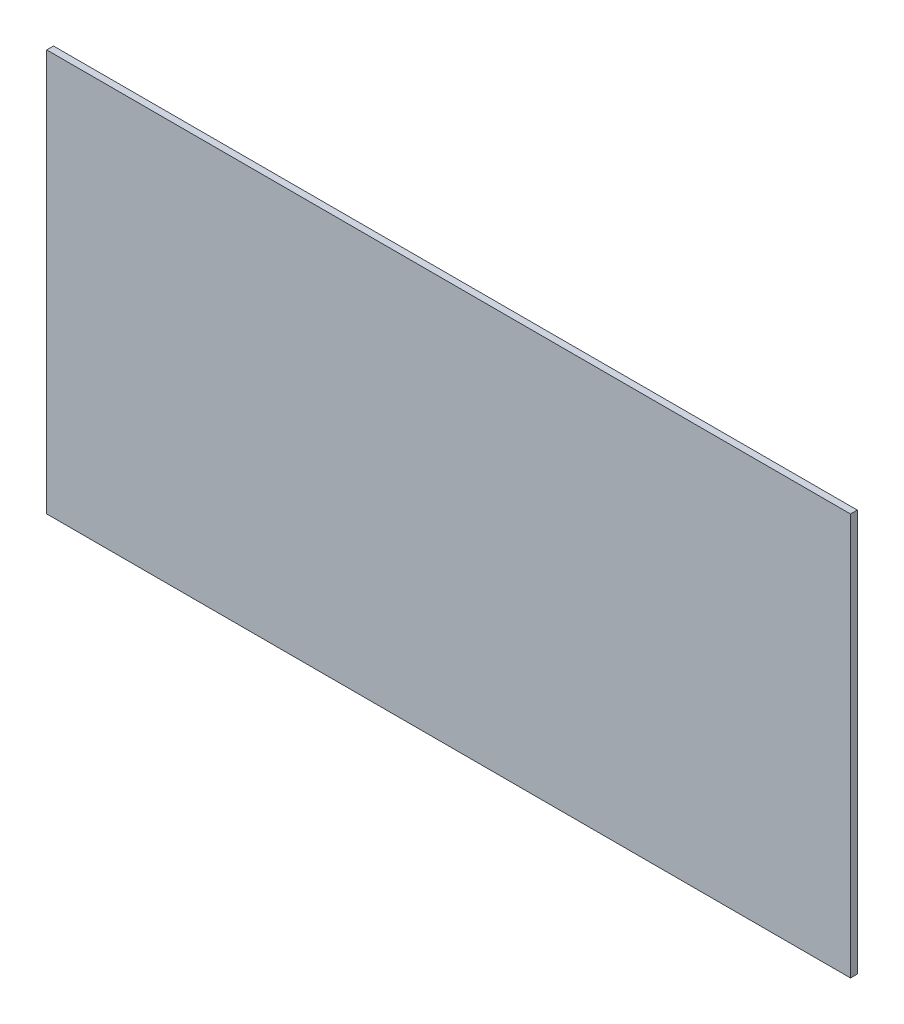
ISO-10303-21;
HEADER;
FILE_DESCRIPTION(('STEP AP214'),'2;1');
FILE_NAME('part.step','',(''),(''),'','','');
FILE_SCHEMA(('AUTOMOTIVE_DESIGN { 1 0 10303 214 1 1 1 1 }'));
ENDSEC;
DATA;
#1=APPLICATION_CONTEXT('core data for automotive mechanical design processes');
#2=APPLICATION_PROTOCOL_DEFINITION('international standard','automotive_design',2000,#1);
#3=PRODUCT_CONTEXT('',#1,'mechanical');
#4=PRODUCT('Part','Part','',(#3));
#5=PRODUCT_RELATED_PRODUCT_CATEGORY('part','',(#4));
#6=PRODUCT_DEFINITION_FORMATION('','',#4);
#7=PRODUCT_DEFINITION_CONTEXT('part definition',#1,'design');
#8=PRODUCT_DEFINITION('design','',#6,#7);
#9=PRODUCT_DEFINITION_SHAPE('','',#8);
#10=(LENGTH_UNIT() NAMED_UNIT(*) SI_UNIT(.MILLI.,.METRE.));
#11=(NAMED_UNIT(*) PLANE_ANGLE_UNIT() SI_UNIT($,.RADIAN.));
#12=(NAMED_UNIT(*) SI_UNIT($,.STERADIAN.) SOLID_ANGLE_UNIT());
#13=UNCERTAINTY_MEASURE_WITH_UNIT(LENGTH_MEASURE(1.E-05),#10,'distance_accuracy_value','');
#14=(GEOMETRIC_REPRESENTATION_CONTEXT(3) GLOBAL_UNCERTAINTY_ASSIGNED_CONTEXT((#13)) GLOBAL_UNIT_ASSIGNED_CONTEXT((#10,
#11,#12)) REPRESENTATION_CONTEXT('',''));
#15=CARTESIAN_POINT('',(0.,0.,0.));
#16=DIRECTION('',(0.,0.,1.));
#17=DIRECTION('',(1.,0.,0.));
#18=AXIS2_PLACEMENT_3D('',#15,#16,#17);
#19=CARTESIAN_POINT('',(-134.671052631579,118.861842105263,3.));
#20=DIRECTION('',(1.,0.,0.));
#21=DIRECTION('',(0.,1.,0.));
#22=AXIS2_PLACEMENT_3D('',#19,#20,#21);
#23=PLANE('',#22);
#24=DIRECTION('',(0.,-1.,0.));
#25=VECTOR('',#24,1.);
#26=CARTESIAN_POINT('',(-134.671052631579,118.861842105263,0.));
#27=LINE('',#26,#25);
#28=CARTESIAN_POINT('',(-134.671052631579,118.861842105263,0.));
#29=VERTEX_POINT('',#28);
#30=CARTESIAN_POINT('',(-134.671052631579,-59.1381578947368,0.));
#31=VERTEX_POINT('',#30);
#32=EDGE_CURVE('E100',#29,#31,#27,.T.);
#33=ORIENTED_EDGE('',*,*,#32,.T.);
#34=DIRECTION('',(0.,0.,-1.));
#35=VECTOR('',#34,1.);
#36=CARTESIAN_POINT('',(-134.671052631579,-59.1381578947368,3.));
#37=LINE('',#36,#35);
#38=CARTESIAN_POINT('',(-134.671052631579,-59.1381578947368,3.));
#39=VERTEX_POINT('',#38);
#40=EDGE_CURVE('E11',#39,#31,#37,.T.);
#41=ORIENTED_EDGE('',*,*,#40,.F.);
#42=DIRECTION('',(0.,-1.,0.));
#43=VECTOR('',#42,1.);
#44=CARTESIAN_POINT('',(-134.671052631579,118.861842105263,3.));
#45=LINE('',#44,#43);
#46=CARTESIAN_POINT('',(-134.671052631579,118.861842105263,3.));
#47=VERTEX_POINT('',#46);
#48=EDGE_CURVE('E88',#47,#39,#45,.T.);
#49=ORIENTED_EDGE('',*,*,#48,.F.);
#50=DIRECTION('',(0.,0.,-1.));
#51=VECTOR('',#50,1.);
#52=CARTESIAN_POINT('',(-134.671052631579,118.861842105263,3.));
#53=LINE('',#52,#51);
#54=EDGE_CURVE('E96',#47,#29,#53,.T.);
#55=ORIENTED_EDGE('',*,*,#54,.T.);
#56=EDGE_LOOP('',(#33,#41,#49,#55));
#57=FACE_BOUND('',#56,.T.);
#58=ADVANCED_FACE('F37',(#57),#23,.F.);
#59=CARTESIAN_POINT('',(-134.671052631579,-59.1381578947368,3.));
#60=DIRECTION('',(0.,1.,0.));
#61=DIRECTION('',(0.,0.,1.));
#62=AXIS2_PLACEMENT_3D('',#59,#60,#61);
#63=PLANE('',#62);
#64=DIRECTION('',(1.,0.,0.));
#65=VECTOR('',#64,1.);
#66=CARTESIAN_POINT('',(-134.671052631579,-59.1381578947368,0.));
#67=LINE('',#66,#65);
#68=CARTESIAN_POINT('',(221.328947368421,-59.1381578947368,0.));
#69=VERTEX_POINT('',#68);
#70=EDGE_CURVE('E92',#31,#69,#67,.T.);
#71=ORIENTED_EDGE('',*,*,#70,.T.);
#72=DIRECTION('',(0.,0.,-1.));
#73=VECTOR('',#72,1.);
#74=CARTESIAN_POINT('',(221.328947368421,-59.1381578947368,3.));
#75=LINE('',#74,#73);
#76=CARTESIAN_POINT('',(221.328947368421,-59.1381578947368,3.));
#77=VERTEX_POINT('',#76);
#78=EDGE_CURVE('E45',#77,#69,#75,.T.);
#79=ORIENTED_EDGE('',*,*,#78,.F.);
#80=DIRECTION('',(1.,0.,0.));
#81=VECTOR('',#80,1.);
#82=CARTESIAN_POINT('',(-134.671052631579,-59.1381578947368,3.));
#83=LINE('',#82,#81);
#84=EDGE_CURVE('E83',#39,#77,#83,.T.);
#85=ORIENTED_EDGE('',*,*,#84,.F.);
#86=ORIENTED_EDGE('',*,*,#40,.T.);
#87=EDGE_LOOP('',(#71,#79,#85,#86));
#88=FACE_BOUND('',#87,.T.);
#89=ADVANCED_FACE('F91',(#88),#63,.F.);
#90=CARTESIAN_POINT('',(221.328947368421,118.861842105263,3.));
#91=DIRECTION('',(-1.,0.,0.));
#92=DIRECTION('',(0.,0.,1.));
#93=AXIS2_PLACEMENT_3D('',#90,#91,#92);
#94=PLANE('',#93);
#95=DIRECTION('',(0.,1.,0.));
#96=VECTOR('',#95,1.);
#97=CARTESIAN_POINT('',(221.328947368421,118.861842105263,0.));
#98=LINE('',#97,#96);
#99=CARTESIAN_POINT('',(221.328947368421,118.861842105263,0.));
#100=VERTEX_POINT('',#99);
#101=EDGE_CURVE('E70',#69,#100,#98,.T.);
#102=ORIENTED_EDGE('',*,*,#101,.T.);
#103=DIRECTION('',(0.,0.,-1.));
#104=VECTOR('',#103,1.);
#105=CARTESIAN_POINT('',(221.328947368421,118.861842105263,3.));
#106=LINE('',#105,#104);
#107=CARTESIAN_POINT('',(221.328947368421,118.861842105263,3.));
#108=VERTEX_POINT('',#107);
#109=EDGE_CURVE('E93',#108,#100,#106,.T.);
#110=ORIENTED_EDGE('',*,*,#109,.F.);
#111=DIRECTION('',(0.,1.,0.));
#112=VECTOR('',#111,1.);
#113=CARTESIAN_POINT('',(221.328947368421,118.861842105263,3.));
#114=LINE('',#113,#112);
#115=EDGE_CURVE('E86',#77,#108,#114,.T.);
#116=ORIENTED_EDGE('',*,*,#115,.F.);
#117=ORIENTED_EDGE('',*,*,#78,.T.);
#118=EDGE_LOOP('',(#102,#110,#116,#117));
#119=FACE_BOUND('',#118,.T.);
#120=ADVANCED_FACE('F94',(#119),#94,.F.);
#121=CARTESIAN_POINT('',(-134.671052631579,118.861842105263,3.));
#122=DIRECTION('',(0.,-1.,0.));
#123=DIRECTION('',(0.,0.,-1.));
#124=AXIS2_PLACEMENT_3D('',#121,#122,#123);
#125=PLANE('',#124);
#126=DIRECTION('',(-1.,0.,0.));
#127=VECTOR('',#126,1.);
#128=CARTESIAN_POINT('',(-134.671052631579,118.861842105263,0.));
#129=LINE('',#128,#127);
#130=EDGE_CURVE('E76',#100,#29,#129,.T.);
#131=ORIENTED_EDGE('',*,*,#130,.T.);
#132=ORIENTED_EDGE('',*,*,#54,.F.);
#133=DIRECTION('',(-1.,0.,0.));
#134=VECTOR('',#133,1.);
#135=CARTESIAN_POINT('',(-134.671052631579,118.861842105263,3.));
#136=LINE('',#135,#134);
#137=EDGE_CURVE('E53',#108,#47,#136,.T.);
#138=ORIENTED_EDGE('',*,*,#137,.F.);
#139=ORIENTED_EDGE('',*,*,#109,.T.);
#140=EDGE_LOOP('',(#131,#132,#138,#139));
#141=FACE_BOUND('',#140,.T.);
#142=ADVANCED_FACE('F107',(#141),#125,.F.);
#143=CARTESIAN_POINT('',(0.,0.,3.));
#144=DIRECTION('',(0.,0.,1.));
#145=DIRECTION('',(1.,0.,0.));
#146=AXIS2_PLACEMENT_3D('',#143,#144,#145);
#147=PLANE('',#146);
#148=ORIENTED_EDGE('',*,*,#48,.T.);
#149=ORIENTED_EDGE('',*,*,#84,.T.);
#150=ORIENTED_EDGE('',*,*,#115,.T.);
#151=ORIENTED_EDGE('',*,*,#137,.T.);
#152=EDGE_LOOP('',(#148,#149,#150,#151));
#153=FACE_BOUND('',#152,.T.);
#154=ADVANCED_FACE('F84',(#153),#147,.T.);
#155=CARTESIAN_POINT('',(0.,0.,0.));
#156=DIRECTION('',(0.,0.,1.));
#157=DIRECTION('',(1.,0.,0.));
#158=AXIS2_PLACEMENT_3D('',#155,#156,#157);
#159=PLANE('',#158);
#160=ORIENTED_EDGE('',*,*,#32,.F.);
#161=ORIENTED_EDGE('',*,*,#130,.F.);
#162=ORIENTED_EDGE('',*,*,#101,.F.);
#163=ORIENTED_EDGE('',*,*,#70,.F.);
#164=EDGE_LOOP('',(#160,#161,#162,#163));
#165=FACE_BOUND('',#164,.T.);
#166=ADVANCED_FACE('F110',(#165),#159,.F.);
#167=CLOSED_SHELL('',(#58,#89,#120,#142,#154,#166));
#168=MANIFOLD_SOLID_BREP('B2',#167);
#169=ADVANCED_BREP_SHAPE_REPRESENTATION('',(#18,#168),#14);
#170=SHAPE_DEFINITION_REPRESENTATION(#9,#169);
ENDSEC;
END-ISO-10303-21;
